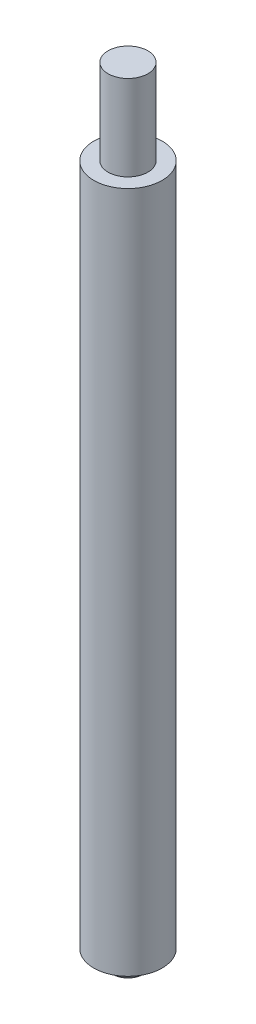
ISO-10303-21;
HEADER;
FILE_DESCRIPTION(('STEP AP214'),'2;1');
FILE_NAME('part.step','',(''),(''),'','','');
FILE_SCHEMA(('AUTOMOTIVE_DESIGN { 1 0 10303 214 1 1 1 1 }'));
ENDSEC;
DATA;
#1=APPLICATION_CONTEXT('core data for automotive mechanical design processes');
#2=APPLICATION_PROTOCOL_DEFINITION('international standard','automotive_design',2000,#1);
#3=PRODUCT_CONTEXT('',#1,'mechanical');
#4=PRODUCT('Part','Part','',(#3));
#5=PRODUCT_RELATED_PRODUCT_CATEGORY('part','',(#4));
#6=PRODUCT_DEFINITION_FORMATION('','',#4);
#7=PRODUCT_DEFINITION_CONTEXT('part definition',#1,'design');
#8=PRODUCT_DEFINITION('design','',#6,#7);
#9=PRODUCT_DEFINITION_SHAPE('','',#8);
#10=(LENGTH_UNIT() NAMED_UNIT(*) SI_UNIT(.MILLI.,.METRE.));
#11=(NAMED_UNIT(*) PLANE_ANGLE_UNIT() SI_UNIT($,.RADIAN.));
#12=(NAMED_UNIT(*) SI_UNIT($,.STERADIAN.) SOLID_ANGLE_UNIT());
#13=UNCERTAINTY_MEASURE_WITH_UNIT(LENGTH_MEASURE(1.E-05),#10,'distance_accuracy_value','');
#14=(GEOMETRIC_REPRESENTATION_CONTEXT(3) GLOBAL_UNCERTAINTY_ASSIGNED_CONTEXT((#13)) GLOBAL_UNIT_ASSIGNED_CONTEXT((#10,
#11,#12)) REPRESENTATION_CONTEXT('',''));
#15=CARTESIAN_POINT('',(0.,0.,0.));
#16=DIRECTION('',(0.,0.,1.));
#17=DIRECTION('',(1.,0.,0.));
#18=AXIS2_PLACEMENT_3D('',#15,#16,#17);
#19=CARTESIAN_POINT('',(-99.3926050411412,-22.870352222622,70.5012035041328));
#20=DIRECTION('',(0.,1.,0.));
#21=DIRECTION('',(1.,0.,0.));
#22=AXIS2_PLACEMENT_3D('',#19,#20,#21);
#23=PLANE('',#22);
#24=CARTESIAN_POINT('',(-96.5893707110904,-22.8703522226219,75.7239489757952));
#25=CARTESIAN_POINT('',(-96.5885696645829,-22.8703522226218,75.7398008793075));
#26=CARTESIAN_POINT('',(-96.5871393023222,-22.8703522226218,75.7556388761153));
#27=CARTESIAN_POINT('',(-96.5850772034629,-22.8703522226218,75.7714255133737));
#28=CARTESIAN_POINT('',(-96.5749507225986,-22.8703522226218,75.8489499634685));
#29=CARTESIAN_POINT('',(-96.5497825974003,-22.8703522226219,75.923757815053));
#30=CARTESIAN_POINT('',(-96.5109856066505,-22.8703522226219,75.9916351463889));
#31=CARTESIAN_POINT('',(-96.4722075428566,-22.8703522226219,76.059479364042));
#32=CARTESIAN_POINT('',(-96.4205541095877,-22.8703522226219,76.1191046338745));
#33=CARTESIAN_POINT('',(-96.3589260071509,-22.8703522226219,76.1671511324862));
#34=CARTESIAN_POINT('',(-96.2973250688428,-22.8703522226219,76.2151764534009));
#35=CARTESIAN_POINT('',(-96.2269365932853,-22.870352222622,76.250714364057));
#36=CARTESIAN_POINT('',(-96.1517163844037,-22.870352222622,76.2717608130783));
#37=CARTESIAN_POINT('',(-96.0765085796929,-22.870352222622,76.29280379144));
#38=CARTESIAN_POINT('',(-95.9979117224615,-22.8703522226219,76.2989567430461));
#39=CARTESIAN_POINT('',(-95.9203458105234,-22.8703522226219,76.2898720341445));
#40=CARTESIAN_POINT('',(-95.8427651883605,-22.8703522226219,76.2807856023455));
#41=CARTESIAN_POINT('',(-95.767703496262,-22.8703522226219,76.2566299980015));
#42=CARTESIAN_POINT('',(-95.699382226635,-22.8703522226219,76.2187674889173));
#43=CARTESIAN_POINT('',(-95.631030661903,-22.8703522226219,76.1808881907907));
#44=CARTESIAN_POINT('',(-95.5707354622098,-22.870352222622,76.1300159508531));
#45=CARTESIAN_POINT('',(-95.5218858678231,-22.870352222622,76.0690193405158));
#46=CARTESIAN_POINT('',(-95.4730135198585,-22.870352222622,76.0079943186606));
#47=CARTESIAN_POINT('',(-95.4365325386921,-22.8703522226219,75.9380033214627));
#48=CARTESIAN_POINT('',(-95.4144915364898,-22.8703522226219,75.8629910599377));
#49=CARTESIAN_POINT('',(-95.395448723515,-22.8703522226219,75.7981825519614));
#50=CARTESIAN_POINT('',(-95.3874986557177,-22.870352222622,75.7306948689909));
#51=CARTESIAN_POINT('',(-95.3909002359445,-22.870352222622,75.6633825725774));
#52=B_SPLINE_CURVE_WITH_KNOTS('',3,(#24,#25,#26,#27,#28,#29,#30,#31,#32,#33,#34,#35,#36,#37,#38,
#39,#40,#41,#42,#43,#44,#45,#46,#47,#48,#49,#50,#51),.UNSPECIFIED.,.F.,.F.,(4,3,3,3,3,3,3,3,3,
4),(0.0452466733133367,0.0500228745215861,0.073477671521762,0.0969210261936302,
0.120354047620129,0.143783204829764,0.167216805333635,0.190660796794682,0.214115708196684,
0.234380099401249),.UNSPECIFIED.);
#53=CARTESIAN_POINT('',(-96.5893707806797,-22.870352222622,75.7239489793118));
#54=VERTEX_POINT('',#53);
#55=CARTESIAN_POINT('',(-95.3909002094045,-22.870352222622,75.6633825712362));
#56=VERTEX_POINT('',#55);
#57=EDGE_CURVE('P0_E11',#54,#56,#52,.T.);
#58=ORIENTED_EDGE('',*,*,#57,.T.);
#59=CARTESIAN_POINT('',(-95.3909002359445,-22.870352222622,75.6633825725774));
#60=CARTESIAN_POINT('',(-95.3914367067498,-22.870352222622,75.6527666001602));
#61=CARTESIAN_POINT('',(-95.392255528773,-22.870352222622,75.6421549901587));
#62=CARTESIAN_POINT('',(-95.393357717638,-22.870352222622,75.6315589404459));
#63=CARTESIAN_POINT('',(-95.4014472818951,-22.870352222622,75.5537887617204));
#64=CARTESIAN_POINT('',(-95.4246472553191,-22.870352222622,75.4783397524713));
#65=CARTESIAN_POINT('',(-95.4616539377801,-22.870352222622,75.4094622628594));
#66=CARTESIAN_POINT('',(-95.4986430290306,-22.870352222622,75.3406175143185));
#67=CARTESIAN_POINT('',(-95.5487201584437,-22.870352222622,75.279651362768));
#68=CARTESIAN_POINT('',(-95.6090727261214,-22.870352222622,75.229999841875));
#69=CARTESIAN_POINT('',(-95.6693933176958,-22.870352222622,75.1803746274381));
#70=CARTESIAN_POINT('',(-95.7388255164488,-22.8703522226219,75.1430007640054));
#71=CARTESIAN_POINT('',(-95.813468094813,-22.8703522226219,75.1199868608319));
#72=CARTESIAN_POINT('',(-95.8880917555862,-22.8703522226219,75.0969787903562));
#73=CARTESIAN_POINT('',(-95.9664932601537,-22.870352222622,75.0887644136945));
#74=CARTESIAN_POINT('',(-96.0442648301171,-22.870352222622,75.0958084792881));
#75=CARTESIAN_POINT('',(-96.0960328353978,-22.870352222622,75.1004973035591));
#76=CARTESIAN_POINT('',(-96.1468607692933,-22.870352222622,75.1118866059722));
#77=CARTESIAN_POINT('',(-96.1954942801977,-22.870352222622,75.1296085164089));
#78=B_SPLINE_CURVE_WITH_KNOTS('',3,(#59,#60,#61,#62,#63,#64,#65,#66,#67,#68,#69,#70,#71,#72,#73,
#74,#75,#76,#77),.UNSPECIFIED.,.F.,.F.,(4,3,3,3,3,3,4),(0.234380099401249,0.23757604174078,
0.261032802861967,0.284478413758538,0.307911602660338,0.331338852599491,0.346933008653388),.UNSPECIFIED.);
#79=CARTESIAN_POINT('',(-96.1954942801975,-22.8703522226115,75.1296085164095));
#80=VERTEX_POINT('',#79);
#81=EDGE_CURVE('P0_E32',#56,#80,#78,.T.);
#82=ORIENTED_EDGE('',*,*,#81,.T.);
#83=CARTESIAN_POINT('',(-96.1954942801977,-22.870352222622,75.1296085164089));
#84=CARTESIAN_POINT('',(-96.2199375782554,-22.870352222622,75.1385155833859));
#85=CARTESIAN_POINT('',(-96.2438265907147,-22.8703522226219,75.1490221994737));
#86=CARTESIAN_POINT('',(-96.2670021326447,-22.8703522226219,75.1610814682389));
#87=CARTESIAN_POINT('',(-96.336324942194,-22.8703522226219,75.1971532198485));
#88=CARTESIAN_POINT('',(-96.3979345144249,-22.8703522226481,75.2464259216063));
#89=CARTESIAN_POINT('',(-96.4483681848328,-22.8703522226481,75.3061198351149));
#90=CARTESIAN_POINT('',(-96.4769375316165,-22.8703522226481,75.3399348658693));
#91=CARTESIAN_POINT('',(-96.5016783329602,-22.8703522226221,75.3768072011245));
#92=CARTESIAN_POINT('',(-96.5221400510057,-22.8703522226221,75.4160626150536));
#93=CARTESIAN_POINT('',(-96.542603587924,-22.8703522226221,75.4553215184553));
#94=CARTESIAN_POINT('',(-96.5586622142239,-22.870352222622,75.496723971349));
#95=CARTESIAN_POINT('',(-96.5700237062356,-22.870352222622,75.5395134542378));
#96=CARTESIAN_POINT('',(-96.5860071150638,-22.870352222622,75.5997099317648));
#97=CARTESIAN_POINT('',(-96.5925044283521,-22.8703522226219,75.6619358676874));
#98=CARTESIAN_POINT('',(-96.5893707110904,-22.8703522226219,75.7239489757952));
#99=B_SPLINE_CURVE_WITH_KNOTS('',3,(#83,#84,#85,#86,#87,#88,#89,#90,#91,#92,#93,#94,#95,#96,#97,
#98),.UNSPECIFIED.,.F.,.F.,(4,3,3,3,3,4),(-0.0312816859046258,-0.023444032457539,0.,
0.0132804272992794,0.0265620351156599,0.0452466733133367),.UNSPECIFIED.);
#100=EDGE_CURVE('P0_E49',#80,#54,#99,.T.);
#101=ORIENTED_EDGE('',*,*,#100,.T.);
#102=EDGE_LOOP('',(#58,#82,#101));
#103=FACE_BOUND('',#102,.T.);
#104=ADVANCED_FACE('P0_F17',(#103),#23,.T.);
#105=CARTESIAN_POINT('',(-96.1954942801977,-22.870352222622,75.1296085164089));
#106=CARTESIAN_POINT('',(-96.1954942801977,-34.870352222622,75.1296085164089));
#107=CARTESIAN_POINT('',(-96.1468607692933,-22.870352222622,75.1118866059722));
#108=CARTESIAN_POINT('',(-96.1468607692933,-34.870352222622,75.1118866059722));
#109=CARTESIAN_POINT('',(-96.0960328353978,-22.870352222622,75.1004973035591));
#110=CARTESIAN_POINT('',(-96.0960328353978,-34.870352222622,75.1004973035591));
#111=CARTESIAN_POINT('',(-95.9664932601537,-22.870352222622,75.0887644136945));
#112=CARTESIAN_POINT('',(-95.9664932601537,-34.870352222622,75.0887644136945));
#113=CARTESIAN_POINT('',(-95.8880917555862,-22.8703522226219,75.0969787903562));
#114=CARTESIAN_POINT('',(-95.8880917555862,-34.8703522226219,75.0969787903562));
#115=CARTESIAN_POINT('',(-95.7388255164488,-22.8703522226219,75.1430007640054));
#116=CARTESIAN_POINT('',(-95.7388255164488,-34.8703522226219,75.1430007640054));
#117=CARTESIAN_POINT('',(-95.6693933176958,-22.870352222622,75.1803746274381));
#118=CARTESIAN_POINT('',(-95.6693933176958,-34.870352222622,75.1803746274381));
#119=CARTESIAN_POINT('',(-95.5487201584437,-22.870352222622,75.279651362768));
#120=CARTESIAN_POINT('',(-95.5487201584437,-34.870352222622,75.279651362768));
#121=CARTESIAN_POINT('',(-95.4986430290306,-22.870352222622,75.3406175143185));
#122=CARTESIAN_POINT('',(-95.4986430290306,-34.8703522226221,75.3406175143185));
#123=CARTESIAN_POINT('',(-95.4246472553191,-22.870352222622,75.4783397524713));
#124=CARTESIAN_POINT('',(-95.4246472553191,-34.8703522226221,75.4783397524713));
#125=CARTESIAN_POINT('',(-95.4014472818951,-22.870352222622,75.5537887617204));
#126=CARTESIAN_POINT('',(-95.4014472818951,-34.870352222622,75.5537887617204));
#127=CARTESIAN_POINT('',(-95.3852669213547,-22.870352222622,75.7093409634309));
#128=CARTESIAN_POINT('',(-95.3852669213547,-34.870352222622,75.7093409634309));
#129=CARTESIAN_POINT('',(-95.392445439003,-22.8703522226219,75.7879614576037));
#130=CARTESIAN_POINT('',(-95.392445439003,-34.8703522226219,75.7879614576037));
#131=CARTESIAN_POINT('',(-95.4365325386921,-22.8703522226219,75.9380033214627));
#132=CARTESIAN_POINT('',(-95.4365325386921,-34.8703522226219,75.9380033214627));
#133=CARTESIAN_POINT('',(-95.4730135198585,-22.870352222622,76.0079943186606));
#134=CARTESIAN_POINT('',(-95.4730135198585,-34.870352222622,76.0079943186606));
#135=CARTESIAN_POINT('',(-95.5707354622098,-22.870352222622,76.1300159508531));
#136=CARTESIAN_POINT('',(-95.5707354622098,-34.870352222622,76.1300159508531));
#137=CARTESIAN_POINT('',(-95.631030661903,-22.8703522226219,76.1808881907907));
#138=CARTESIAN_POINT('',(-95.631030661903,-34.8703522226219,76.1808881907907));
#139=CARTESIAN_POINT('',(-95.767703496262,-22.8703522226219,76.2566299980015));
#140=CARTESIAN_POINT('',(-95.767703496262,-34.8703522226219,76.2566299980015));
#141=CARTESIAN_POINT('',(-95.8427651883605,-22.8703522226219,76.2807856023455));
#142=CARTESIAN_POINT('',(-95.8427651883605,-34.8703522226219,76.2807856023455));
#143=CARTESIAN_POINT('',(-95.9979117224615,-22.8703522226219,76.2989567430461));
#144=CARTESIAN_POINT('',(-95.9979117224615,-34.8703522226219,76.2989567430461));
#145=CARTESIAN_POINT('',(-96.0765085796929,-22.870352222622,76.29280379144));
#146=CARTESIAN_POINT('',(-96.0765085796929,-34.870352222622,76.29280379144));
#147=CARTESIAN_POINT('',(-96.2269365932853,-22.870352222622,76.250714364057));
#148=CARTESIAN_POINT('',(-96.2269365932853,-34.870352222622,76.250714364057));
#149=CARTESIAN_POINT('',(-96.2973250688428,-22.8703522226219,76.2151764534009));
#150=CARTESIAN_POINT('',(-96.2973250688428,-34.8703522226219,76.2151764534009));
#151=CARTESIAN_POINT('',(-96.4205541095877,-22.8703522226219,76.1191046338745));
#152=CARTESIAN_POINT('',(-96.4205541095877,-34.8703522226219,76.1191046338745));
#153=CARTESIAN_POINT('',(-96.4722075428566,-22.8703522226219,76.059479364042));
#154=CARTESIAN_POINT('',(-96.4722075428566,-34.8703522226219,76.059479364042));
#155=CARTESIAN_POINT('',(-96.5497825974003,-22.8703522226219,75.923757815053));
#156=CARTESIAN_POINT('',(-96.5497825974003,-34.8703522226219,75.923757815053));
#157=CARTESIAN_POINT('',(-96.5749507225986,-22.8703522226218,75.8489499634685));
#158=CARTESIAN_POINT('',(-96.5749507225986,-34.8703522226218,75.8489499634685));
#159=CARTESIAN_POINT('',(-96.5952062931029,-22.8703522226218,75.693881091493));
#160=CARTESIAN_POINT('',(-96.5952062931029,-34.8703522226218,75.693881091493));
#161=CARTESIAN_POINT('',(-96.5900928231064,-22.870352222622,75.6150974648632));
#162=CARTESIAN_POINT('',(-96.5900928231064,-34.870352222622,75.6150974648632));
#163=CARTESIAN_POINT('',(-96.5586622142239,-22.870352222622,75.496723971349));
#164=CARTESIAN_POINT('',(-96.5586622142239,-34.870352222622,75.496723971349));
#165=CARTESIAN_POINT('',(-96.542603587924,-22.8703522226221,75.4553215184553));
#166=CARTESIAN_POINT('',(-96.542603587924,-34.8703522226221,75.4553215184553));
#167=CARTESIAN_POINT('',(-96.5016783329602,-22.8703522226221,75.3768072011245));
#168=CARTESIAN_POINT('',(-96.5016783329602,-34.8703522226221,75.3768072011245));
#169=CARTESIAN_POINT('',(-96.4769375316165,-22.8703522226481,75.3399348658693));
#170=CARTESIAN_POINT('',(-96.4769375316165,-34.8703522226481,75.3399348658693));
#171=CARTESIAN_POINT('',(-96.4483681848328,-22.8703522226481,75.3061198351149));
#172=CARTESIAN_POINT('',(-96.4483681848328,-34.8703522226481,75.3061198351149));
#173=CARTESIAN_POINT('',(-96.3979345144249,-22.8703522226481,75.2464259216063));
#174=CARTESIAN_POINT('',(-96.3979345144249,-34.8703522226481,75.2464259216063));
#175=CARTESIAN_POINT('',(-96.336324942194,-22.8703522226219,75.1971532198485));
#176=CARTESIAN_POINT('',(-96.336324942194,-34.8703522226219,75.1971532198485));
#177=CARTESIAN_POINT('',(-96.2438265907147,-22.8703522226219,75.1490221994737));
#178=CARTESIAN_POINT('',(-96.2438265907147,-34.8703522226219,75.1490221994737));
#179=CARTESIAN_POINT('',(-96.2199375782554,-22.870352222622,75.1385155833859));
#180=CARTESIAN_POINT('',(-96.2199375782554,-34.870352222622,75.1385155833859));
#181=CARTESIAN_POINT('',(-96.1954942801977,-22.870352222622,75.1296085164089));
#182=CARTESIAN_POINT('',(-96.1954942801977,-34.870352222622,75.1296085164089));
#183=B_SPLINE_SURFACE_WITH_KNOTS('',3,1,((#105,#106),(#107,#108),(#109,#110),(#111,#112),(#113,
#114),(#115,#116),(#117,#118),(#119,#120),(#121,#122),(#123,#124),(#125,#126),(#127,#128),(#129,
#130),(#131,#132),(#133,#134),(#135,#136),(#137,#138),(#139,#140),(#141,#142),(#143,#144),(#145,
#146),(#147,#148),(#149,#150),(#151,#152),(#153,#154),(#155,#156),(#157,#158),(#159,#160),(#161,
#162),(#163,#164),(#165,#166),(#167,#168),(#169,#170),(#171,#172),(#173,#174),(#175,#176),(#177,
#178),(#179,#180),(#181,#182)),.UNSPECIFIED.,.T.,.F.,.F.,(4,2,2,2,2,2,2,2,2,2,2,2,2,2,2,2,3,2,
4),(2,2),(-0.346933008653388,-0.331338852599491,-0.307911602660338,-0.284478413758538,
-0.261032802861967,-0.23757604174078,-0.214115708196684,-0.190660796794682,-0.167216805333635,
-0.143783204829764,-0.120354047620129,-0.0969210261936302,-0.073477671521762,
-0.0500228745215862,-0.02656203511566,-0.0132804272992794,0.,0.023444032457539,
0.0312816859046258),(0.,1.2),.UNSPECIFIED.);
#184=CARTESIAN_POINT('',(-96.1954942801977,-34.870352222622,75.1296085164089));
#185=CARTESIAN_POINT('',(-96.1468607692933,-34.870352222622,75.1118866059722));
#186=CARTESIAN_POINT('',(-96.0960328353978,-34.8703522226219,75.1004973035591));
#187=CARTESIAN_POINT('',(-96.0442648301171,-34.8703522226219,75.0958084792881));
#188=CARTESIAN_POINT('',(-95.9664932601537,-34.8703522226219,75.0887644136945));
#189=CARTESIAN_POINT('',(-95.8880917555862,-34.8703522226219,75.0969787903562));
#190=CARTESIAN_POINT('',(-95.813468094813,-34.8703522226219,75.1199868608319));
#191=CARTESIAN_POINT('',(-95.7388255164488,-34.8703522226219,75.1430007640054));
#192=CARTESIAN_POINT('',(-95.6693933176958,-34.870352222622,75.1803746274381));
#193=CARTESIAN_POINT('',(-95.6090727261214,-34.870352222622,75.229999841875));
#194=CARTESIAN_POINT('',(-95.5487201584437,-34.870352222622,75.279651362768));
#195=CARTESIAN_POINT('',(-95.4986430290306,-34.870352222622,75.3406175143185));
#196=CARTESIAN_POINT('',(-95.4616539377801,-34.870352222622,75.4094622628594));
#197=CARTESIAN_POINT('',(-95.4246472553191,-34.870352222622,75.4783397524713));
#198=CARTESIAN_POINT('',(-95.4014472818951,-34.870352222622,75.5537887617204));
#199=CARTESIAN_POINT('',(-95.393357717638,-34.870352222622,75.6315589404459));
#200=CARTESIAN_POINT('',(-95.3852669213547,-34.870352222622,75.7093409634309));
#201=CARTESIAN_POINT('',(-95.392445439003,-34.8703522226219,75.7879614576037));
#202=CARTESIAN_POINT('',(-95.4144915364898,-34.8703522226219,75.8629910599377));
#203=CARTESIAN_POINT('',(-95.4365325386921,-34.8703522226219,75.9380033214627));
#204=CARTESIAN_POINT('',(-95.4730135198585,-34.870352222622,76.0079943186606));
#205=CARTESIAN_POINT('',(-95.5218858678231,-34.870352222622,76.0690193405158));
#206=CARTESIAN_POINT('',(-95.5707354622098,-34.870352222622,76.1300159508531));
#207=CARTESIAN_POINT('',(-95.631030661903,-34.8703522226219,76.1808881907907));
#208=CARTESIAN_POINT('',(-95.699382226635,-34.8703522226219,76.2187674889173));
#209=CARTESIAN_POINT('',(-95.767703496262,-34.8703522226219,76.2566299980015));
#210=CARTESIAN_POINT('',(-95.8427651883605,-34.8703522226219,76.2807856023455));
#211=CARTESIAN_POINT('',(-95.9203458105234,-34.8703522226219,76.2898720341445));
#212=CARTESIAN_POINT('',(-95.9979117224615,-34.8703522226219,76.2989567430461));
#213=CARTESIAN_POINT('',(-96.0765085796929,-34.870352222622,76.29280379144));
#214=CARTESIAN_POINT('',(-96.1517163844037,-34.870352222622,76.2717608130783));
#215=CARTESIAN_POINT('',(-96.2269365932853,-34.870352222622,76.250714364057));
#216=CARTESIAN_POINT('',(-96.2973250688428,-34.8703522226219,76.2151764534009));
#217=CARTESIAN_POINT('',(-96.3589260071509,-34.8703522226219,76.1671511324862));
#218=CARTESIAN_POINT('',(-96.4205541095877,-34.8703522226219,76.1191046338745));
#219=CARTESIAN_POINT('',(-96.4722075428566,-34.8703522226218,76.059479364042));
#220=CARTESIAN_POINT('',(-96.5109856066505,-34.8703522226218,75.9916351463889));
#221=CARTESIAN_POINT('',(-96.5497825974003,-34.8703522226218,75.923757815053));
#222=CARTESIAN_POINT('',(-96.5749507225986,-34.8703522226218,75.8489499634685));
#223=CARTESIAN_POINT('',(-96.5850772034629,-34.8703522226218,75.7714255133737));
#224=CARTESIAN_POINT('',(-96.5952062931029,-34.8703522226218,75.693881091493));
#225=CARTESIAN_POINT('',(-96.5900928231064,-34.8703522226219,75.6150974648632));
#226=CARTESIAN_POINT('',(-96.5700237062356,-34.8703522226219,75.5395134542378));
#227=CARTESIAN_POINT('',(-96.5586622142239,-34.8703522226219,75.496723971349));
#228=CARTESIAN_POINT('',(-96.542603587924,-34.8703522226221,75.4553215184553));
#229=CARTESIAN_POINT('',(-96.5221400510057,-34.8703522226221,75.4160626150536));
#230=CARTESIAN_POINT('',(-96.5016783329602,-34.8703522226221,75.3768072011245));
#231=CARTESIAN_POINT('',(-96.4769375316165,-34.870352222648,75.3399348658693));
#232=CARTESIAN_POINT('',(-96.4483681848328,-34.870352222648,75.3061198351149));
#233=CARTESIAN_POINT('',(-96.3979345144249,-34.870352222648,75.2464259216063));
#234=CARTESIAN_POINT('',(-96.336324942194,-34.8703522226219,75.1971532198485));
#235=CARTESIAN_POINT('',(-96.2670021326447,-34.8703522226219,75.1610814682389));
#236=CARTESIAN_POINT('',(-96.2438265907147,-34.8703522226219,75.1490221994737));
#237=CARTESIAN_POINT('',(-96.2199375782554,-34.870352222622,75.1385155833859));
#238=CARTESIAN_POINT('',(-96.1954942801977,-34.870352222622,75.1296085164089));
#239=B_SPLINE_CURVE_WITH_KNOTS('',3,(#184,#185,#186,#187,#188,#189,#190,#191,#192,#193,#194,
#195,#196,#197,#198,#199,#200,#201,#202,#203,#204,#205,#206,#207,#208,#209,#210,#211,#212,#213,
#214,#215,#216,#217,#218,#219,#220,#221,#222,#223,#224,#225,#226,#227,#228,#229,#230,#231,#232,
#233,#234,#235,#236,#237,#238),.UNSPECIFIED.,.T.,.F.,(4,3,3,3,3,3,3,3,3,3,3,3,3,3,3,3,3,3,4),
(-0.346933008653388,-0.331338852599491,-0.307911602660338,-0.284478413758538,-0.261032802861967,
-0.23757604174078,-0.214115708196684,-0.190660796794682,-0.167216805333635,-0.143783204829764,
-0.120354047620129,-0.0969210261936303,-0.0734776715217621,-0.0500228745215862,
-0.02656203511566,-0.0132804272992794,0.,0.023444032457539,0.0312816859046258),.UNSPECIFIED.);
#240=CARTESIAN_POINT('',(-96.1954942801977,-34.870352222622,75.1296085164089));
#241=VERTEX_POINT('',#240);
#242=EDGE_CURVE('P0_E23',#241,#241,#239,.T.);
#243=ORIENTED_EDGE('',*,*,#242,.F.);
#244=EDGE_LOOP('',(#243));
#245=FACE_BOUND('',#244,.T.);
#246=ORIENTED_EDGE('',*,*,#100,.F.);
#247=ORIENTED_EDGE('',*,*,#81,.F.);
#248=ORIENTED_EDGE('',*,*,#57,.F.);
#249=EDGE_LOOP('',(#246,#247,#248));
#250=FACE_BOUND('',#249,.T.);
#251=ADVANCED_FACE('P0_F19',(#245,#250),#183,.T.);
#252=CARTESIAN_POINT('',(-99.1265857335007,-34.870352222622,70.9734861644489));
#253=DIRECTION('',(0.,1.,0.));
#254=DIRECTION('',(1.,0.,0.));
#255=AXIS2_PLACEMENT_3D('',#252,#253,#254);
#256=PLANE('',#255);
#257=ORIENTED_EDGE('',*,*,#242,.T.);
#258=EDGE_LOOP('',(#257));
#259=FACE_BOUND('',#258,.T.);
#260=ADVANCED_FACE('P0_F78',(#259),#256,.F.);
#261=CLOSED_SHELL('',(#104,#251,#260));
#262=MANIFOLD_SOLID_BREP('P0_B1',#261);
#263=CARTESIAN_POINT('',(-81.665808000505,-21.3703528404236,27.730238100206));
#264=DIRECTION('',(0.,1.,0.));
#265=DIRECTION('',(0.,0.,-1.));
#266=AXIS2_PLACEMENT_3D('',#263,#264,#265);
#267=PLANE('',#266);
#268=CARTESIAN_POINT('',(-95.9901354950421,-21.3703528404236,75.693665775274));
#269=DIRECTION('',(0.,1.,0.));
#270=DIRECTION('',(2.1425115015461E-09,0.,1.));
#271=AXIS2_PLACEMENT_3D('',#268,#269,#270);
#272=CIRCLE('',#271,0.35);
#273=CARTESIAN_POINT('',(-95.9901354942922,-21.3703528404236,76.043665775274));
#274=VERTEX_POINT('',#273);
#275=EDGE_CURVE('P1_E10',#274,#274,#272,.T.);
#276=ORIENTED_EDGE('',*,*,#275,.T.);
#277=EDGE_LOOP('',(#276));
#278=FACE_BOUND('',#277,.T.);
#279=ADVANCED_FACE('P1_F15',(#278),#267,.T.);
#280=CARTESIAN_POINT('',(-95.9901354950421,-22.8703528404236,75.693665775274));
#281=DIRECTION('',(0.,1.,0.));
#282=DIRECTION('',(2.1425115015461E-09,0.,1.));
#283=AXIS2_PLACEMENT_3D('',#280,#281,#282);
#284=CYLINDRICAL_SURFACE('',#283,0.35);
#285=CARTESIAN_POINT('',(-95.9901354950421,-34.9703528404236,75.693665775274));
#286=DIRECTION('',(0.,-1.,0.));
#287=DIRECTION('',(2.14248936052691E-09,0.,1.));
#288=AXIS2_PLACEMENT_3D('',#285,#286,#287);
#289=CIRCLE('',#288,0.35);
#290=CARTESIAN_POINT('',(-95.9901354942922,-34.9703528404236,76.043665775274));
#291=VERTEX_POINT('',#290);
#292=EDGE_CURVE('P1_E23',#291,#291,#289,.T.);
#293=ORIENTED_EDGE('',*,*,#292,.F.);
#294=EDGE_LOOP('',(#293));
#295=FACE_BOUND('',#294,.T.);
#296=ORIENTED_EDGE('',*,*,#275,.F.);
#297=EDGE_LOOP('',(#296));
#298=FACE_BOUND('',#297,.T.);
#299=ADVANCED_FACE('P1_F49',(#295,#298),#284,.T.);
#300=CARTESIAN_POINT('',(-81.665808000505,-35.1703528404236,27.730238100206));
#301=DIRECTION('',(0.,1.,0.));
#302=DIRECTION('',(0.,0.,-1.));
#303=AXIS2_PLACEMENT_3D('',#300,#301,#302);
#304=PLANE('',#303);
#305=CARTESIAN_POINT('',(-95.9901354950421,-35.1703528404236,75.693665775274));
#306=DIRECTION('',(0.,1.,0.));
#307=DIRECTION('',(2.14248936052691E-09,0.,1.));
#308=AXIS2_PLACEMENT_3D('',#305,#306,#307);
#309=CIRCLE('',#308,0.15);
#310=CARTESIAN_POINT('',(-95.9901354947207,-35.1703528404236,75.843665775274));
#311=VERTEX_POINT('',#310);
#312=EDGE_CURVE('P1_E33',#311,#311,#309,.T.);
#313=ORIENTED_EDGE('',*,*,#312,.F.);
#314=EDGE_LOOP('',(#313));
#315=FACE_BOUND('',#314,.T.);
#316=ADVANCED_FACE('P1_F47',(#315),#304,.F.);
#317=CARTESIAN_POINT('',(-95.9901354950422,-34.9703528404236,75.693665775274));
#318=DIRECTION('',(0.,-1.,0.));
#319=DIRECTION('',(0.,0.,-1.));
#320=AXIS2_PLACEMENT_3D('',#317,#318,#319);
#321=DEGENERATE_TOROIDAL_SURFACE('',#320,0.150000000000067,0.200000000000013,.T.);
#322=ORIENTED_EDGE('',*,*,#292,.T.);
#323=EDGE_LOOP('',(#322));
#324=FACE_BOUND('',#323,.T.);
#325=ORIENTED_EDGE('',*,*,#312,.T.);
#326=EDGE_LOOP('',(#325));
#327=FACE_BOUND('',#326,.T.);
#328=ADVANCED_FACE('P1_F17',(#324,#327),#321,.T.);
#329=CLOSED_SHELL('',(#279,#299,#316,#328));
#330=MANIFOLD_SOLID_BREP('P1_B1',#329);
#331=ADVANCED_BREP_SHAPE_REPRESENTATION('',(#18,#262,#330),#14);
#332=SHAPE_DEFINITION_REPRESENTATION(#9,#331);
ENDSEC;
END-ISO-10303-21;
